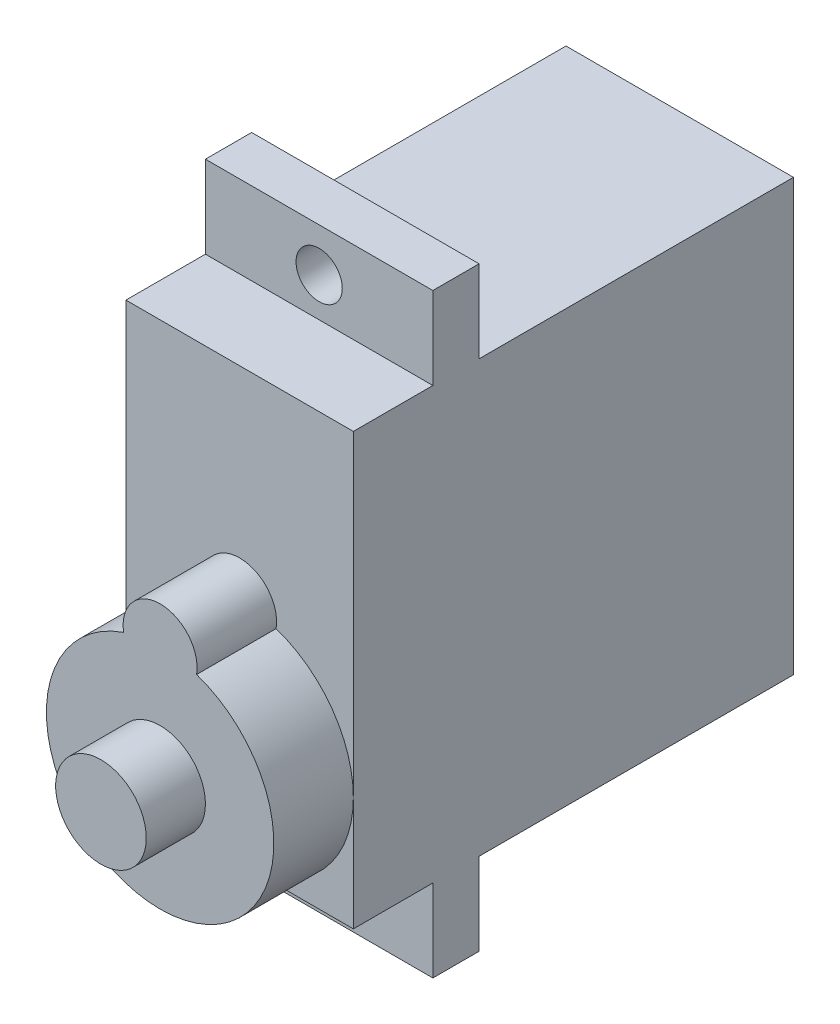
ISO-10303-21;
HEADER;
FILE_DESCRIPTION(('STEP AP214'),'2;1');
FILE_NAME('part.step','',(''),(''),'','','');
FILE_SCHEMA(('AUTOMOTIVE_DESIGN { 1 0 10303 214 1 1 1 1 }'));
ENDSEC;
DATA;
#1=APPLICATION_CONTEXT('core data for automotive mechanical design processes');
#2=APPLICATION_PROTOCOL_DEFINITION('international standard','automotive_design',2000,#1);
#3=PRODUCT_CONTEXT('',#1,'mechanical');
#4=PRODUCT('Part','Part','',(#3));
#5=PRODUCT_RELATED_PRODUCT_CATEGORY('part','',(#4));
#6=PRODUCT_DEFINITION_FORMATION('','',#4);
#7=PRODUCT_DEFINITION_CONTEXT('part definition',#1,'design');
#8=PRODUCT_DEFINITION('design','',#6,#7);
#9=PRODUCT_DEFINITION_SHAPE('','',#8);
#10=(LENGTH_UNIT() NAMED_UNIT(*) SI_UNIT(.MILLI.,.METRE.));
#11=(NAMED_UNIT(*) PLANE_ANGLE_UNIT() SI_UNIT($,.RADIAN.));
#12=(NAMED_UNIT(*) SI_UNIT($,.STERADIAN.) SOLID_ANGLE_UNIT());
#13=UNCERTAINTY_MEASURE_WITH_UNIT(LENGTH_MEASURE(1.E-05),#10,'distance_accuracy_value','');
#14=(GEOMETRIC_REPRESENTATION_CONTEXT(3) GLOBAL_UNCERTAINTY_ASSIGNED_CONTEXT((#13)) GLOBAL_UNIT_ASSIGNED_CONTEXT((#10,
#11,#12)) REPRESENTATION_CONTEXT('',''));
#15=CARTESIAN_POINT('',(0.,0.,0.));
#16=DIRECTION('',(0.,0.,1.));
#17=DIRECTION('',(1.,0.,0.));
#18=AXIS2_PLACEMENT_3D('',#15,#16,#17);
#19=CARTESIAN_POINT('',(0.,0.,23.8));
#20=DIRECTION('',(0.,0.,-1.));
#21=DIRECTION('',(-1.,0.,0.));
#22=AXIS2_PLACEMENT_3D('',#19,#20,#21);
#23=PLANE('',#22);
#24=CARTESIAN_POINT('',(6.15,12.3,23.8));
#25=DIRECTION('',(0.,0.,1.));
#26=DIRECTION('',(1.,0.,0.));
#27=AXIS2_PLACEMENT_3D('',#24,#25,#26);
#28=CIRCLE('',#27,2.);
#29=CARTESIAN_POINT('',(8.12338360307049,11.9747967479675,23.8));
#30=VERTEX_POINT('',#29);
#31=CARTESIAN_POINT('',(4.17661639692951,11.9747967479675,23.8));
#32=VERTEX_POINT('',#31);
#33=EDGE_CURVE('E165',#30,#32,#28,.T.);
#34=ORIENTED_EDGE('',*,*,#33,.F.);
#35=CARTESIAN_POINT('',(6.15,6.15,23.8));
#36=DIRECTION('',(0.,0.,1.));
#37=DIRECTION('',(1.,0.,0.));
#38=AXIS2_PLACEMENT_3D('',#35,#36,#37);
#39=CIRCLE('',#38,6.15);
#40=CARTESIAN_POINT('',(12.3,6.15,23.8));
#41=VERTEX_POINT('',#40);
#42=EDGE_CURVE('E270',#41,#30,#39,.T.);
#43=ORIENTED_EDGE('',*,*,#42,.F.);
#44=DIRECTION('',(0.,1.,0.));
#45=VECTOR('',#44,1.);
#46=CARTESIAN_POINT('',(12.3,23.3,23.8));
#47=LINE('',#46,#45);
#48=CARTESIAN_POINT('',(12.3,23.3,23.8));
#49=VERTEX_POINT('',#48);
#50=EDGE_CURVE('E176',#41,#49,#47,.T.);
#51=ORIENTED_EDGE('',*,*,#50,.T.);
#52=DIRECTION('',(-1.,0.,0.));
#53=VECTOR('',#52,1.);
#54=CARTESIAN_POINT('',(12.3,23.3,23.8));
#55=LINE('',#54,#53);
#56=CARTESIAN_POINT('',(0.,23.3,23.8));
#57=VERTEX_POINT('',#56);
#58=EDGE_CURVE('E175',#49,#57,#55,.T.);
#59=ORIENTED_EDGE('',*,*,#58,.T.);
#60=DIRECTION('',(0.,-1.,0.));
#61=VECTOR('',#60,1.);
#62=CARTESIAN_POINT('',(0.,23.3,23.8));
#63=LINE('',#62,#61);
#64=CARTESIAN_POINT('',(0.,6.15,23.8));
#65=VERTEX_POINT('',#64);
#66=EDGE_CURVE('E179',#57,#65,#63,.T.);
#67=ORIENTED_EDGE('',*,*,#66,.T.);
#68=EDGE_CURVE('E47',#32,#65,#39,.T.);
#69=ORIENTED_EDGE('',*,*,#68,.F.);
#70=EDGE_LOOP('',(#34,#43,#51,#59,#67,#69));
#71=FACE_BOUND('',#70,.T.);
#72=ADVANCED_FACE('F36',(#71),#23,.F.);
#73=CARTESIAN_POINT('',(6.15,0.,23.8));
#74=VERTEX_POINT('',#73);
#75=EDGE_CURVE('E11',#65,#74,#39,.T.);
#76=ORIENTED_EDGE('',*,*,#75,.F.);
#77=CARTESIAN_POINT('',(0.,0.,23.8));
#78=VERTEX_POINT('',#77);
#79=EDGE_CURVE('E178',#65,#78,#63,.T.);
#80=ORIENTED_EDGE('',*,*,#79,.T.);
#81=DIRECTION('',(1.,0.,0.));
#82=VECTOR('',#81,1.);
#83=CARTESIAN_POINT('',(12.3,0.,23.8));
#84=LINE('',#83,#82);
#85=EDGE_CURVE('E182',#78,#74,#84,.T.);
#86=ORIENTED_EDGE('',*,*,#85,.T.);
#87=EDGE_LOOP('',(#76,#80,#86));
#88=FACE_BOUND('',#87,.T.);
#89=ADVANCED_FACE('F295',(#88),#23,.F.);
#90=CARTESIAN_POINT('',(0.,0.,19.5));
#91=DIRECTION('',(0.,0.,1.));
#92=DIRECTION('',(1.,0.,0.));
#93=AXIS2_PLACEMENT_3D('',#90,#91,#92);
#94=PLANE('',#93);
#95=DIRECTION('',(1.,0.,0.));
#96=VECTOR('',#95,1.);
#97=CARTESIAN_POINT('',(12.3,0.,19.5));
#98=LINE('',#97,#96);
#99=CARTESIAN_POINT('',(0.,0.,19.5));
#100=VERTEX_POINT('',#99);
#101=CARTESIAN_POINT('',(12.3,0.,19.5));
#102=VERTEX_POINT('',#101);
#103=EDGE_CURVE('E169',#100,#102,#98,.T.);
#104=ORIENTED_EDGE('',*,*,#103,.F.);
#105=DIRECTION('',(0.,-1.,0.));
#106=VECTOR('',#105,1.);
#107=CARTESIAN_POINT('',(0.,27.75,19.5));
#108=LINE('',#107,#106);
#109=CARTESIAN_POINT('',(0.,-4.45,19.5));
#110=VERTEX_POINT('',#109);
#111=EDGE_CURVE('E215',#100,#110,#108,.T.);
#112=ORIENTED_EDGE('',*,*,#111,.T.);
#113=DIRECTION('',(1.,0.,0.));
#114=VECTOR('',#113,1.);
#115=CARTESIAN_POINT('',(0.,-4.45,19.5));
#116=LINE('',#115,#114);
#117=CARTESIAN_POINT('',(12.3,-4.45,19.5));
#118=VERTEX_POINT('',#117);
#119=EDGE_CURVE('E214',#110,#118,#116,.T.);
#120=ORIENTED_EDGE('',*,*,#119,.T.);
#121=DIRECTION('',(0.,1.,0.));
#122=VECTOR('',#121,1.);
#123=CARTESIAN_POINT('',(12.3,27.75,19.5));
#124=LINE('',#123,#122);
#125=EDGE_CURVE('E218',#118,#102,#124,.T.);
#126=ORIENTED_EDGE('',*,*,#125,.T.);
#127=EDGE_LOOP('',(#104,#112,#120,#126));
#128=FACE_BOUND('',#127,.T.);
#129=CARTESIAN_POINT('',(6.15,-2.1,19.5));
#130=DIRECTION('',(0.,0.,1.));
#131=DIRECTION('',(-1.,0.,0.));
#132=AXIS2_PLACEMENT_3D('',#129,#130,#131);
#133=CIRCLE('',#132,1.25);
#134=CARTESIAN_POINT('',(4.9,-2.1,19.5));
#135=VERTEX_POINT('',#134);
#136=EDGE_CURVE('E200',#135,#135,#133,.T.);
#137=ORIENTED_EDGE('',*,*,#136,.F.);
#138=EDGE_LOOP('',(#137));
#139=FACE_BOUND('',#138,.T.);
#140=ADVANCED_FACE('F301',(#128,#139),#94,.T.);
#141=CARTESIAN_POINT('',(0.,0.,17.));
#142=DIRECTION('',(1.,0.,0.));
#143=DIRECTION('',(0.,0.,-1.));
#144=AXIS2_PLACEMENT_3D('',#141,#142,#143);
#145=PLANE('',#144);
#146=DIRECTION('',(0.,-1.,0.));
#147=VECTOR('',#146,1.);
#148=CARTESIAN_POINT('',(0.,0.,0.));
#149=LINE('',#148,#147);
#150=CARTESIAN_POINT('',(0.,23.3,0.));
#151=VERTEX_POINT('',#150);
#152=CARTESIAN_POINT('',(0.,0.,0.));
#153=VERTEX_POINT('',#152);
#154=EDGE_CURVE('E245',#151,#153,#149,.T.);
#155=ORIENTED_EDGE('',*,*,#154,.T.);
#156=DIRECTION('',(0.,0.,-1.));
#157=VECTOR('',#156,1.);
#158=CARTESIAN_POINT('',(0.,0.,17.));
#159=LINE('',#158,#157);
#160=CARTESIAN_POINT('',(0.,0.,17.));
#161=VERTEX_POINT('',#160);
#162=EDGE_CURVE('E40',#161,#153,#159,.T.);
#163=ORIENTED_EDGE('',*,*,#162,.F.);
#164=DIRECTION('',(0.,-1.,0.));
#165=VECTOR('',#164,1.);
#166=CARTESIAN_POINT('',(0.,27.75,17.));
#167=LINE('',#166,#165);
#168=CARTESIAN_POINT('',(0.,-4.45,17.));
#169=VERTEX_POINT('',#168);
#170=EDGE_CURVE('E209',#161,#169,#167,.T.);
#171=ORIENTED_EDGE('',*,*,#170,.T.);
#172=DIRECTION('',(0.,0.,-1.));
#173=VECTOR('',#172,1.);
#174=CARTESIAN_POINT('',(0.,-4.45,19.5));
#175=LINE('',#174,#173);
#176=EDGE_CURVE('E242',#110,#169,#175,.T.);
#177=ORIENTED_EDGE('',*,*,#176,.F.);
#178=ORIENTED_EDGE('',*,*,#111,.F.);
#179=DIRECTION('',(0.,0.,-1.));
#180=VECTOR('',#179,1.);
#181=CARTESIAN_POINT('',(0.,0.,23.8));
#182=LINE('',#181,#180);
#183=EDGE_CURVE('E190',#78,#100,#182,.T.);
#184=ORIENTED_EDGE('',*,*,#183,.F.);
#185=ORIENTED_EDGE('',*,*,#79,.F.);
#186=ORIENTED_EDGE('',*,*,#66,.F.);
#187=DIRECTION('',(0.,0.,-1.));
#188=VECTOR('',#187,1.);
#189=CARTESIAN_POINT('',(0.,23.3,23.8));
#190=LINE('',#189,#188);
#191=CARTESIAN_POINT('',(0.,23.3,19.5));
#192=VERTEX_POINT('',#191);
#193=EDGE_CURVE('E193',#57,#192,#190,.T.);
#194=ORIENTED_EDGE('',*,*,#193,.T.);
#195=CARTESIAN_POINT('',(0.,27.75,19.5));
#196=VERTEX_POINT('',#195);
#197=EDGE_CURVE('E212',#196,#192,#108,.T.);
#198=ORIENTED_EDGE('',*,*,#197,.F.);
#199=DIRECTION('',(0.,0.,-1.));
#200=VECTOR('',#199,1.);
#201=CARTESIAN_POINT('',(0.,27.75,19.5));
#202=LINE('',#201,#200);
#203=CARTESIAN_POINT('',(0.,27.75,17.));
#204=VERTEX_POINT('',#203);
#205=EDGE_CURVE('E222',#196,#204,#202,.T.);
#206=ORIENTED_EDGE('',*,*,#205,.T.);
#207=CARTESIAN_POINT('',(0.,23.3,17.));
#208=VERTEX_POINT('',#207);
#209=EDGE_CURVE('E223',#204,#208,#167,.T.);
#210=ORIENTED_EDGE('',*,*,#209,.T.);
#211=DIRECTION('',(0.,0.,-1.));
#212=VECTOR('',#211,1.);
#213=CARTESIAN_POINT('',(0.,23.3,17.));
#214=LINE('',#213,#212);
#215=EDGE_CURVE('E253',#208,#151,#214,.T.);
#216=ORIENTED_EDGE('',*,*,#215,.T.);
#217=EDGE_LOOP('',(#155,#163,#171,#177,#178,#184,#185,#186,#194,#198,#206,#210,#216));
#218=FACE_BOUND('',#217,.T.);
#219=ADVANCED_FACE('F38',(#218),#145,.F.);
#220=CARTESIAN_POINT('',(0.,0.,17.));
#221=DIRECTION('',(0.,1.,0.));
#222=DIRECTION('',(0.,0.,1.));
#223=AXIS2_PLACEMENT_3D('',#220,#221,#222);
#224=PLANE('',#223);
#225=DIRECTION('',(1.,0.,0.));
#226=VECTOR('',#225,1.);
#227=CARTESIAN_POINT('',(0.,0.,0.));
#228=LINE('',#227,#226);
#229=CARTESIAN_POINT('',(12.3,0.,0.));
#230=VERTEX_POINT('',#229);
#231=EDGE_CURVE('E256',#153,#230,#228,.T.);
#232=ORIENTED_EDGE('',*,*,#231,.T.);
#233=DIRECTION('',(0.,0.,-1.));
#234=VECTOR('',#233,1.);
#235=CARTESIAN_POINT('',(12.3,0.,17.));
#236=LINE('',#235,#234);
#237=CARTESIAN_POINT('',(12.3,0.,17.));
#238=VERTEX_POINT('',#237);
#239=EDGE_CURVE('E265',#238,#230,#236,.T.);
#240=ORIENTED_EDGE('',*,*,#239,.F.);
#241=DIRECTION('',(1.,0.,0.));
#242=VECTOR('',#241,1.);
#243=CARTESIAN_POINT('',(0.,0.,17.));
#244=LINE('',#243,#242);
#245=EDGE_CURVE('E246',#161,#238,#244,.T.);
#246=ORIENTED_EDGE('',*,*,#245,.F.);
#247=ORIENTED_EDGE('',*,*,#162,.T.);
#248=EDGE_LOOP('',(#232,#240,#246,#247));
#249=FACE_BOUND('',#248,.T.);
#250=ADVANCED_FACE('F354',(#249),#224,.F.);
#251=CARTESIAN_POINT('',(12.3,0.,17.));
#252=DIRECTION('',(-1.,0.,0.));
#253=DIRECTION('',(0.,0.,1.));
#254=AXIS2_PLACEMENT_3D('',#251,#252,#253);
#255=PLANE('',#254);
#256=DIRECTION('',(0.,1.,0.));
#257=VECTOR('',#256,1.);
#258=CARTESIAN_POINT('',(12.3,0.,0.));
#259=LINE('',#258,#257);
#260=CARTESIAN_POINT('',(12.3,23.3,0.));
#261=VERTEX_POINT('',#260);
#262=EDGE_CURVE('E258',#230,#261,#259,.T.);
#263=ORIENTED_EDGE('',*,*,#262,.T.);
#264=DIRECTION('',(0.,0.,-1.));
#265=VECTOR('',#264,1.);
#266=CARTESIAN_POINT('',(12.3,23.3,17.));
#267=LINE('',#266,#265);
#268=CARTESIAN_POINT('',(12.3,23.3,17.));
#269=VERTEX_POINT('',#268);
#270=EDGE_CURVE('E263',#269,#261,#267,.T.);
#271=ORIENTED_EDGE('',*,*,#270,.F.);
#272=DIRECTION('',(0.,1.,0.));
#273=VECTOR('',#272,1.);
#274=CARTESIAN_POINT('',(12.3,27.75,17.));
#275=LINE('',#274,#273);
#276=CARTESIAN_POINT('',(12.3,27.75,17.));
#277=VERTEX_POINT('',#276);
#278=EDGE_CURVE('E228',#269,#277,#275,.T.);
#279=ORIENTED_EDGE('',*,*,#278,.T.);
#280=DIRECTION('',(0.,0.,-1.));
#281=VECTOR('',#280,1.);
#282=CARTESIAN_POINT('',(12.3,27.75,19.5));
#283=LINE('',#282,#281);
#284=CARTESIAN_POINT('',(12.3,27.75,19.5));
#285=VERTEX_POINT('',#284);
#286=EDGE_CURVE('E236',#285,#277,#283,.T.);
#287=ORIENTED_EDGE('',*,*,#286,.F.);
#288=CARTESIAN_POINT('',(12.3,23.3,19.5));
#289=VERTEX_POINT('',#288);
#290=EDGE_CURVE('E217',#289,#285,#124,.T.);
#291=ORIENTED_EDGE('',*,*,#290,.F.);
#292=DIRECTION('',(0.,0.,-1.));
#293=VECTOR('',#292,1.);
#294=CARTESIAN_POINT('',(12.3,23.3,23.8));
#295=LINE('',#294,#293);
#296=EDGE_CURVE('E196',#49,#289,#295,.T.);
#297=ORIENTED_EDGE('',*,*,#296,.F.);
#298=ORIENTED_EDGE('',*,*,#50,.F.);
#299=CARTESIAN_POINT('',(12.3,0.,23.8));
#300=VERTEX_POINT('',#299);
#301=EDGE_CURVE('E173',#300,#41,#47,.T.);
#302=ORIENTED_EDGE('',*,*,#301,.F.);
#303=DIRECTION('',(0.,0.,-1.));
#304=VECTOR('',#303,1.);
#305=CARTESIAN_POINT('',(12.3,0.,23.8));
#306=LINE('',#305,#304);
#307=EDGE_CURVE('E184',#300,#102,#306,.T.);
#308=ORIENTED_EDGE('',*,*,#307,.T.);
#309=ORIENTED_EDGE('',*,*,#125,.F.);
#310=DIRECTION('',(0.,0.,-1.));
#311=VECTOR('',#310,1.);
#312=CARTESIAN_POINT('',(12.3,-4.45,19.5));
#313=LINE('',#312,#311);
#314=CARTESIAN_POINT('',(12.3,-4.45,17.));
#315=VERTEX_POINT('',#314);
#316=EDGE_CURVE('E239',#118,#315,#313,.T.);
#317=ORIENTED_EDGE('',*,*,#316,.T.);
#318=EDGE_CURVE('E229',#315,#238,#275,.T.);
#319=ORIENTED_EDGE('',*,*,#318,.T.);
#320=ORIENTED_EDGE('',*,*,#239,.T.);
#321=EDGE_LOOP('',(#263,#271,#279,#287,#291,#297,#298,#302,#308,#309,#317,#319,#320));
#322=FACE_BOUND('',#321,.T.);
#323=ADVANCED_FACE('F351',(#322),#255,.F.);
#324=CARTESIAN_POINT('',(0.,23.3,17.));
#325=DIRECTION('',(0.,-1.,0.));
#326=DIRECTION('',(0.,0.,-1.));
#327=AXIS2_PLACEMENT_3D('',#324,#325,#326);
#328=PLANE('',#327);
#329=DIRECTION('',(-1.,0.,0.));
#330=VECTOR('',#329,1.);
#331=CARTESIAN_POINT('',(0.,23.3,0.));
#332=LINE('',#331,#330);
#333=EDGE_CURVE('E250',#261,#151,#332,.T.);
#334=ORIENTED_EDGE('',*,*,#333,.T.);
#335=ORIENTED_EDGE('',*,*,#215,.F.);
#336=DIRECTION('',(-1.,0.,0.));
#337=VECTOR('',#336,1.);
#338=CARTESIAN_POINT('',(0.,23.3,17.));
#339=LINE('',#338,#337);
#340=EDGE_CURVE('E249',#269,#208,#339,.T.);
#341=ORIENTED_EDGE('',*,*,#340,.F.);
#342=ORIENTED_EDGE('',*,*,#270,.T.);
#343=EDGE_LOOP('',(#334,#335,#341,#342));
#344=FACE_BOUND('',#343,.T.);
#345=ADVANCED_FACE('F347',(#344),#328,.F.);
#346=CARTESIAN_POINT('',(0.,0.,0.));
#347=DIRECTION('',(0.,0.,-1.));
#348=DIRECTION('',(-1.,0.,0.));
#349=AXIS2_PLACEMENT_3D('',#346,#347,#348);
#350=PLANE('',#349);
#351=ORIENTED_EDGE('',*,*,#154,.F.);
#352=ORIENTED_EDGE('',*,*,#333,.F.);
#353=ORIENTED_EDGE('',*,*,#262,.F.);
#354=ORIENTED_EDGE('',*,*,#231,.F.);
#355=EDGE_LOOP('',(#351,#352,#353,#354));
#356=FACE_BOUND('',#355,.T.);
#357=ADVANCED_FACE('F337',(#356),#350,.T.);
#358=CARTESIAN_POINT('',(0.,0.,17.));
#359=DIRECTION('',(0.,0.,1.));
#360=DIRECTION('',(1.,0.,0.));
#361=AXIS2_PLACEMENT_3D('',#358,#359,#360);
#362=PLANE('',#361);
#363=CARTESIAN_POINT('',(6.15,-2.1,17.));
#364=DIRECTION('',(0.,0.,1.));
#365=DIRECTION('',(-1.,0.,0.));
#366=AXIS2_PLACEMENT_3D('',#363,#364,#365);
#367=CIRCLE('',#366,1.25);
#368=CARTESIAN_POINT('',(4.9,-2.1,17.));
#369=VERTEX_POINT('',#368);
#370=EDGE_CURVE('E199',#369,#369,#367,.T.);
#371=ORIENTED_EDGE('',*,*,#370,.T.);
#372=EDGE_LOOP('',(#371));
#373=FACE_BOUND('',#372,.T.);
#374=ORIENTED_EDGE('',*,*,#170,.F.);
#375=ORIENTED_EDGE('',*,*,#245,.T.);
#376=ORIENTED_EDGE('',*,*,#318,.F.);
#377=DIRECTION('',(1.,0.,0.));
#378=VECTOR('',#377,1.);
#379=CARTESIAN_POINT('',(0.,-4.45,17.));
#380=LINE('',#379,#378);
#381=EDGE_CURVE('E226',#169,#315,#380,.T.);
#382=ORIENTED_EDGE('',*,*,#381,.F.);
#383=EDGE_LOOP('',(#374,#375,#376,#382));
#384=FACE_BOUND('',#383,.T.);
#385=ADVANCED_FACE('F334',(#373,#384),#362,.F.);
#386=CARTESIAN_POINT('',(6.15,25.4,17.));
#387=DIRECTION('',(0.,0.,1.));
#388=DIRECTION('',(1.,0.,0.));
#389=AXIS2_PLACEMENT_3D('',#386,#387,#388);
#390=CIRCLE('',#389,1.25);
#391=CARTESIAN_POINT('',(7.4,25.4,17.));
#392=VERTEX_POINT('',#391);
#393=EDGE_CURVE('E203',#392,#392,#390,.T.);
#394=ORIENTED_EDGE('',*,*,#393,.T.);
#395=EDGE_LOOP('',(#394));
#396=FACE_BOUND('',#395,.T.);
#397=ORIENTED_EDGE('',*,*,#278,.F.);
#398=ORIENTED_EDGE('',*,*,#340,.T.);
#399=ORIENTED_EDGE('',*,*,#209,.F.);
#400=DIRECTION('',(-1.,0.,0.));
#401=VECTOR('',#400,1.);
#402=CARTESIAN_POINT('',(0.,27.75,17.));
#403=LINE('',#402,#401);
#404=EDGE_CURVE('E232',#277,#204,#403,.T.);
#405=ORIENTED_EDGE('',*,*,#404,.F.);
#406=EDGE_LOOP('',(#397,#398,#399,#405));
#407=FACE_BOUND('',#406,.T.);
#408=ADVANCED_FACE('F332',(#396,#407),#362,.F.);
#409=DIRECTION('',(-1.,0.,0.));
#410=VECTOR('',#409,1.);
#411=CARTESIAN_POINT('',(12.3,23.3,19.5));
#412=LINE('',#411,#410);
#413=EDGE_CURVE('E166',#289,#192,#412,.T.);
#414=ORIENTED_EDGE('',*,*,#413,.F.);
#415=ORIENTED_EDGE('',*,*,#290,.T.);
#416=DIRECTION('',(-1.,0.,0.));
#417=VECTOR('',#416,1.);
#418=CARTESIAN_POINT('',(0.,27.75,19.5));
#419=LINE('',#418,#417);
#420=EDGE_CURVE('E220',#285,#196,#419,.T.);
#421=ORIENTED_EDGE('',*,*,#420,.T.);
#422=ORIENTED_EDGE('',*,*,#197,.T.);
#423=EDGE_LOOP('',(#414,#415,#421,#422));
#424=FACE_BOUND('',#423,.T.);
#425=CARTESIAN_POINT('',(6.15,25.4,19.5));
#426=DIRECTION('',(0.,0.,1.));
#427=DIRECTION('',(1.,0.,0.));
#428=AXIS2_PLACEMENT_3D('',#425,#426,#427);
#429=CIRCLE('',#428,1.25);
#430=CARTESIAN_POINT('',(7.4,25.4,19.5));
#431=VERTEX_POINT('',#430);
#432=EDGE_CURVE('E206',#431,#431,#429,.T.);
#433=ORIENTED_EDGE('',*,*,#432,.F.);
#434=EDGE_LOOP('',(#433));
#435=FACE_BOUND('',#434,.T.);
#436=ADVANCED_FACE('F328',(#424,#435),#94,.T.);
#437=CARTESIAN_POINT('',(0.,-4.45,19.5));
#438=DIRECTION('',(0.,1.,0.));
#439=DIRECTION('',(-1.,0.,0.));
#440=AXIS2_PLACEMENT_3D('',#437,#438,#439);
#441=PLANE('',#440);
#442=ORIENTED_EDGE('',*,*,#381,.T.);
#443=ORIENTED_EDGE('',*,*,#316,.F.);
#444=ORIENTED_EDGE('',*,*,#119,.F.);
#445=ORIENTED_EDGE('',*,*,#176,.T.);
#446=EDGE_LOOP('',(#442,#443,#444,#445));
#447=FACE_BOUND('',#446,.T.);
#448=ADVANCED_FACE('F331',(#447),#441,.F.);
#449=CARTESIAN_POINT('',(0.,27.75,19.5));
#450=DIRECTION('',(0.,-1.,0.));
#451=DIRECTION('',(0.,0.,-1.));
#452=AXIS2_PLACEMENT_3D('',#449,#450,#451);
#453=PLANE('',#452);
#454=ORIENTED_EDGE('',*,*,#404,.T.);
#455=ORIENTED_EDGE('',*,*,#205,.F.);
#456=ORIENTED_EDGE('',*,*,#420,.F.);
#457=ORIENTED_EDGE('',*,*,#286,.T.);
#458=EDGE_LOOP('',(#454,#455,#456,#457));
#459=FACE_BOUND('',#458,.T.);
#460=ADVANCED_FACE('F326',(#459),#453,.F.);
#461=CARTESIAN_POINT('',(6.15,25.4,19.5));
#462=DIRECTION('',(0.,0.,-1.));
#463=DIRECTION('',(-1.,0.,0.));
#464=AXIS2_PLACEMENT_3D('',#461,#462,#463);
#465=CYLINDRICAL_SURFACE('',#464,1.25);
#466=ORIENTED_EDGE('',*,*,#432,.T.);
#467=EDGE_LOOP('',(#466));
#468=FACE_BOUND('',#467,.T.);
#469=ORIENTED_EDGE('',*,*,#393,.F.);
#470=EDGE_LOOP('',(#469));
#471=FACE_BOUND('',#470,.T.);
#472=ADVANCED_FACE('F322',(#468,#471),#465,.F.);
#473=CARTESIAN_POINT('',(6.15,-2.1,19.5));
#474=DIRECTION('',(0.,0.,-1.));
#475=DIRECTION('',(-1.,0.,0.));
#476=AXIS2_PLACEMENT_3D('',#473,#474,#475);
#477=CYLINDRICAL_SURFACE('',#476,1.25);
#478=ORIENTED_EDGE('',*,*,#136,.T.);
#479=EDGE_LOOP('',(#478));
#480=FACE_BOUND('',#479,.T.);
#481=ORIENTED_EDGE('',*,*,#370,.F.);
#482=EDGE_LOOP('',(#481));
#483=FACE_BOUND('',#482,.T.);
#484=ADVANCED_FACE('F316',(#480,#483),#477,.F.);
#485=CARTESIAN_POINT('',(12.3,23.3,23.8));
#486=DIRECTION('',(0.,-1.,0.));
#487=DIRECTION('',(0.,0.,-1.));
#488=AXIS2_PLACEMENT_3D('',#485,#486,#487);
#489=PLANE('',#488);
#490=ORIENTED_EDGE('',*,*,#413,.T.);
#491=ORIENTED_EDGE('',*,*,#193,.F.);
#492=ORIENTED_EDGE('',*,*,#58,.F.);
#493=ORIENTED_EDGE('',*,*,#296,.T.);
#494=EDGE_LOOP('',(#490,#491,#492,#493));
#495=FACE_BOUND('',#494,.T.);
#496=ADVANCED_FACE('F311',(#495),#489,.F.);
#497=CARTESIAN_POINT('',(12.3,0.,23.8));
#498=DIRECTION('',(0.,1.,0.));
#499=DIRECTION('',(0.,0.,1.));
#500=AXIS2_PLACEMENT_3D('',#497,#498,#499);
#501=PLANE('',#500);
#502=ORIENTED_EDGE('',*,*,#103,.T.);
#503=ORIENTED_EDGE('',*,*,#307,.F.);
#504=EDGE_CURVE('E181',#74,#300,#84,.T.);
#505=ORIENTED_EDGE('',*,*,#504,.F.);
#506=ORIENTED_EDGE('',*,*,#85,.F.);
#507=ORIENTED_EDGE('',*,*,#183,.T.);
#508=EDGE_LOOP('',(#502,#503,#505,#506,#507));
#509=FACE_BOUND('',#508,.T.);
#510=ADVANCED_FACE('F306',(#509),#501,.F.);
#511=EDGE_CURVE('E45',#74,#41,#39,.T.);
#512=ORIENTED_EDGE('',*,*,#511,.F.);
#513=ORIENTED_EDGE('',*,*,#504,.T.);
#514=ORIENTED_EDGE('',*,*,#301,.T.);
#515=EDGE_LOOP('',(#512,#513,#514));
#516=FACE_BOUND('',#515,.T.);
#517=ADVANCED_FACE('F297',(#516),#23,.F.);
#518=CARTESIAN_POINT('',(6.15,12.3,28.1));
#519=DIRECTION('',(0.,0.,-1.));
#520=DIRECTION('',(-1.,0.,0.));
#521=AXIS2_PLACEMENT_3D('',#518,#519,#520);
#522=CYLINDRICAL_SURFACE('',#521,2.);
#523=ORIENTED_EDGE('',*,*,#33,.T.);
#524=DIRECTION('',(0.,0.,-1.));
#525=VECTOR('',#524,1.);
#526=CARTESIAN_POINT('',(4.17661639692951,11.9747967479675,28.1));
#527=LINE('',#526,#525);
#528=CARTESIAN_POINT('',(4.17661639692951,11.9747967479675,28.1));
#529=VERTEX_POINT('',#528);
#530=EDGE_CURVE('E152',#529,#32,#527,.T.);
#531=ORIENTED_EDGE('',*,*,#530,.F.);
#532=CARTESIAN_POINT('',(6.15,12.3,28.1));
#533=DIRECTION('',(0.,0.,1.));
#534=DIRECTION('',(1.,0.,0.));
#535=AXIS2_PLACEMENT_3D('',#532,#533,#534);
#536=CIRCLE('',#535,2.);
#537=CARTESIAN_POINT('',(8.12338360307049,11.9747967479675,28.1));
#538=VERTEX_POINT('',#537);
#539=EDGE_CURVE('E159',#538,#529,#536,.T.);
#540=ORIENTED_EDGE('',*,*,#539,.F.);
#541=DIRECTION('',(0.,0.,-1.));
#542=VECTOR('',#541,1.);
#543=CARTESIAN_POINT('',(8.12338360307049,11.9747967479675,28.1));
#544=LINE('',#543,#542);
#545=EDGE_CURVE('E156',#538,#30,#544,.T.);
#546=ORIENTED_EDGE('',*,*,#545,.T.);
#547=EDGE_LOOP('',(#523,#531,#540,#546));
#548=FACE_BOUND('',#547,.T.);
#549=ADVANCED_FACE('F164',(#548),#522,.T.);
#550=CARTESIAN_POINT('',(6.15,6.15,28.1));
#551=DIRECTION('',(0.,0.,-1.));
#552=DIRECTION('',(-1.,0.,0.));
#553=AXIS2_PLACEMENT_3D('',#550,#551,#552);
#554=CYLINDRICAL_SURFACE('',#553,6.15);
#555=ORIENTED_EDGE('',*,*,#68,.T.);
#556=ORIENTED_EDGE('',*,*,#75,.T.);
#557=ORIENTED_EDGE('',*,*,#511,.T.);
#558=ORIENTED_EDGE('',*,*,#42,.T.);
#559=ORIENTED_EDGE('',*,*,#545,.F.);
#560=CARTESIAN_POINT('',(6.15,6.15,28.1));
#561=DIRECTION('',(0.,0.,1.));
#562=DIRECTION('',(1.,0.,0.));
#563=AXIS2_PLACEMENT_3D('',#560,#561,#562);
#564=CIRCLE('',#563,6.15);
#565=EDGE_CURVE('E148',#529,#538,#564,.T.);
#566=ORIENTED_EDGE('',*,*,#565,.F.);
#567=ORIENTED_EDGE('',*,*,#530,.T.);
#568=EDGE_LOOP('',(#555,#556,#557,#558,#559,#566,#567));
#569=FACE_BOUND('',#568,.T.);
#570=ADVANCED_FACE('F150',(#569),#554,.T.);
#571=CARTESIAN_POINT('',(6.15,9.225,28.1));
#572=DIRECTION('',(0.,0.,1.));
#573=DIRECTION('',(1.,0.,0.));
#574=AXIS2_PLACEMENT_3D('',#571,#572,#573);
#575=PLANE('',#574);
#576=CARTESIAN_POINT('',(6.15,6.15,28.1));
#577=DIRECTION('',(0.,0.,1.));
#578=DIRECTION('',(1.,0.,0.));
#579=AXIS2_PLACEMENT_3D('',#576,#577,#578);
#580=CIRCLE('',#579,2.45);
#581=CARTESIAN_POINT('',(8.6,6.15,28.1));
#582=VERTEX_POINT('',#581);
#583=EDGE_CURVE('E276',#582,#582,#580,.T.);
#584=ORIENTED_EDGE('',*,*,#583,.F.);
#585=EDGE_LOOP('',(#584));
#586=FACE_BOUND('',#585,.T.);
#587=ORIENTED_EDGE('',*,*,#539,.T.);
#588=ORIENTED_EDGE('',*,*,#565,.T.);
#589=EDGE_LOOP('',(#587,#588));
#590=FACE_BOUND('',#589,.T.);
#591=ADVANCED_FACE('F161',(#586,#590),#575,.T.);
#592=CARTESIAN_POINT('',(6.15,6.15,31.3));
#593=DIRECTION('',(0.,0.,-1.));
#594=DIRECTION('',(-1.,0.,0.));
#595=AXIS2_PLACEMENT_3D('',#592,#593,#594);
#596=CYLINDRICAL_SURFACE('',#595,2.45);
#597=CARTESIAN_POINT('',(6.15,6.15,31.3));
#598=DIRECTION('',(0.,0.,1.));
#599=DIRECTION('',(1.,0.,0.));
#600=AXIS2_PLACEMENT_3D('',#597,#598,#599);
#601=CIRCLE('',#600,2.45);
#602=CARTESIAN_POINT('',(8.6,6.15,31.3));
#603=VERTEX_POINT('',#602);
#604=EDGE_CURVE('E274',#603,#603,#601,.T.);
#605=ORIENTED_EDGE('',*,*,#604,.F.);
#606=EDGE_LOOP('',(#605));
#607=FACE_BOUND('',#606,.T.);
#608=ORIENTED_EDGE('',*,*,#583,.T.);
#609=EDGE_LOOP('',(#608));
#610=FACE_BOUND('',#609,.T.);
#611=ADVANCED_FACE('F282',(#607,#610),#596,.T.);
#612=CARTESIAN_POINT('',(6.15,6.15,31.3));
#613=DIRECTION('',(0.,0.,1.));
#614=DIRECTION('',(1.,0.,0.));
#615=AXIS2_PLACEMENT_3D('',#612,#613,#614);
#616=PLANE('',#615);
#617=ORIENTED_EDGE('',*,*,#604,.T.);
#618=EDGE_LOOP('',(#617));
#619=FACE_BOUND('',#618,.T.);
#620=ADVANCED_FACE('F290',(#619),#616,.T.);
#621=CLOSED_SHELL('',(#72,#89,#140,#219,#250,#323,#345,#357,#385,#408,#436,#448,#460,#472,#484,
#496,#510,#517,#549,#570,#591,#611,#620));
#622=MANIFOLD_SOLID_BREP('B2',#621);
#623=ADVANCED_BREP_SHAPE_REPRESENTATION('',(#18,#622),#14);
#624=SHAPE_DEFINITION_REPRESENTATION(#9,#623);
ENDSEC;
END-ISO-10303-21;
